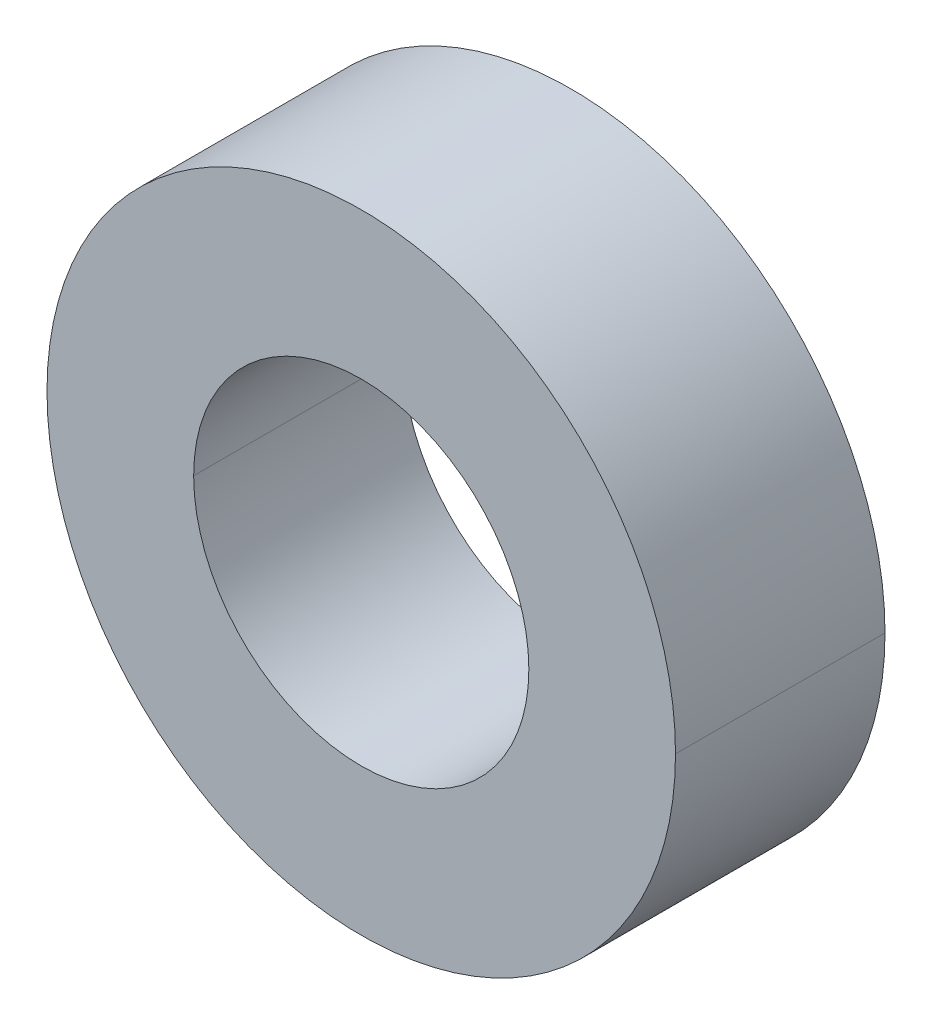
ISO-10303-21;
HEADER;
FILE_DESCRIPTION(('STEP AP214'),'2;1');
FILE_NAME('part.step','',(''),(''),'','','');
FILE_SCHEMA(('AUTOMOTIVE_DESIGN { 1 0 10303 214 1 1 1 1 }'));
ENDSEC;
DATA;
#1=APPLICATION_CONTEXT('core data for automotive mechanical design processes');
#2=APPLICATION_PROTOCOL_DEFINITION('international standard','automotive_design',2000,#1);
#3=PRODUCT_CONTEXT('',#1,'mechanical');
#4=PRODUCT('Part','Part','',(#3));
#5=PRODUCT_RELATED_PRODUCT_CATEGORY('part','',(#4));
#6=PRODUCT_DEFINITION_FORMATION('','',#4);
#7=PRODUCT_DEFINITION_CONTEXT('part definition',#1,'design');
#8=PRODUCT_DEFINITION('design','',#6,#7);
#9=PRODUCT_DEFINITION_SHAPE('','',#8);
#10=(LENGTH_UNIT() NAMED_UNIT(*) SI_UNIT(.MILLI.,.METRE.));
#11=(NAMED_UNIT(*) PLANE_ANGLE_UNIT() SI_UNIT($,.RADIAN.));
#12=(NAMED_UNIT(*) SI_UNIT($,.STERADIAN.) SOLID_ANGLE_UNIT());
#13=UNCERTAINTY_MEASURE_WITH_UNIT(LENGTH_MEASURE(1.E-05),#10,'distance_accuracy_value','');
#14=(GEOMETRIC_REPRESENTATION_CONTEXT(3) GLOBAL_UNCERTAINTY_ASSIGNED_CONTEXT((#13)) GLOBAL_UNIT_ASSIGNED_CONTEXT((#10,
#11,#12)) REPRESENTATION_CONTEXT('',''));
#15=CARTESIAN_POINT('',(0.,0.,0.));
#16=DIRECTION('',(0.,0.,1.));
#17=DIRECTION('',(1.,0.,0.));
#18=AXIS2_PLACEMENT_3D('',#15,#16,#17);
#19=CARTESIAN_POINT('',(0.,0.,2.));
#20=DIRECTION('',(0.,0.,-1.));
#21=DIRECTION('',(0.,1.,0.));
#22=AXIS2_PLACEMENT_3D('',#19,#20,#21);
#23=CYLINDRICAL_SURFACE('',#22,1.6);
#24=CARTESIAN_POINT('',(0.,0.,2.));
#25=DIRECTION('',(0.,0.,1.));
#26=DIRECTION('',(1.,0.,0.));
#27=AXIS2_PLACEMENT_3D('',#24,#25,#26);
#28=CIRCLE('',#27,1.6);
#29=CARTESIAN_POINT('',(-1.6,0.,2.));
#30=VERTEX_POINT('',#29);
#31=CARTESIAN_POINT('',(1.6,0.,2.));
#32=VERTEX_POINT('',#31);
#33=EDGE_CURVE('E11',#30,#32,#28,.T.);
#34=ORIENTED_EDGE('',*,*,#33,.T.);
#35=DIRECTION('',(0.,0.,-1.));
#36=VECTOR('',#35,1.);
#37=CARTESIAN_POINT('',(1.6,0.,2.));
#38=LINE('',#37,#36);
#39=CARTESIAN_POINT('',(1.6,0.,0.));
#40=VERTEX_POINT('',#39);
#41=EDGE_CURVE('E25',#32,#40,#38,.T.);
#42=ORIENTED_EDGE('',*,*,#41,.T.);
#43=CARTESIAN_POINT('',(0.,0.,0.));
#44=DIRECTION('',(0.,0.,1.));
#45=DIRECTION('',(1.,0.,0.));
#46=AXIS2_PLACEMENT_3D('',#43,#44,#45);
#47=CIRCLE('',#46,1.6);
#48=CARTESIAN_POINT('',(-1.6,0.,0.));
#49=VERTEX_POINT('',#48);
#50=EDGE_CURVE('E100',#49,#40,#47,.T.);
#51=ORIENTED_EDGE('',*,*,#50,.F.);
#52=DIRECTION('',(0.,0.,-1.));
#53=VECTOR('',#52,1.);
#54=CARTESIAN_POINT('',(-1.6,0.,2.));
#55=LINE('',#54,#53);
#56=EDGE_CURVE('E95',#30,#49,#55,.T.);
#57=ORIENTED_EDGE('',*,*,#56,.F.);
#58=EDGE_LOOP('',(#34,#42,#51,#57));
#59=FACE_BOUND('',#58,.T.);
#60=ADVANCED_FACE('F17',(#59),#23,.F.);
#61=CARTESIAN_POINT('',(0.,0.,2.));
#62=DIRECTION('',(0.,0.,-1.));
#63=DIRECTION('',(0.,-1.,0.));
#64=AXIS2_PLACEMENT_3D('',#61,#62,#63);
#65=CYLINDRICAL_SURFACE('',#64,1.6);
#66=ORIENTED_EDGE('',*,*,#41,.F.);
#67=CARTESIAN_POINT('',(0.,0.,2.));
#68=DIRECTION('',(0.,0.,1.));
#69=DIRECTION('',(1.,0.,0.));
#70=AXIS2_PLACEMENT_3D('',#67,#68,#69);
#71=CIRCLE('',#70,1.6);
#72=EDGE_CURVE('E90',#32,#30,#71,.T.);
#73=ORIENTED_EDGE('',*,*,#72,.T.);
#74=ORIENTED_EDGE('',*,*,#56,.T.);
#75=CARTESIAN_POINT('',(0.,0.,0.));
#76=DIRECTION('',(0.,0.,1.));
#77=DIRECTION('',(1.,0.,0.));
#78=AXIS2_PLACEMENT_3D('',#75,#76,#77);
#79=CIRCLE('',#78,1.6);
#80=EDGE_CURVE('E85',#40,#49,#79,.T.);
#81=ORIENTED_EDGE('',*,*,#80,.F.);
#82=EDGE_LOOP('',(#66,#73,#74,#81));
#83=FACE_BOUND('',#82,.T.);
#84=ADVANCED_FACE('F112',(#83),#65,.F.);
#85=CARTESIAN_POINT('',(0.,0.,0.));
#86=DIRECTION('',(0.,0.,1.));
#87=DIRECTION('',(1.,0.,0.));
#88=AXIS2_PLACEMENT_3D('',#85,#86,#87);
#89=PLANE('',#88);
#90=CARTESIAN_POINT('',(0.,0.,0.));
#91=DIRECTION('',(0.,0.,1.));
#92=DIRECTION('',(1.,0.,0.));
#93=AXIS2_PLACEMENT_3D('',#90,#91,#92);
#94=CIRCLE('',#93,3.);
#95=CARTESIAN_POINT('',(-3.,0.,0.));
#96=VERTEX_POINT('',#95);
#97=CARTESIAN_POINT('',(3.,0.,0.));
#98=VERTEX_POINT('',#97);
#99=EDGE_CURVE('E74',#96,#98,#94,.T.);
#100=ORIENTED_EDGE('',*,*,#99,.F.);
#101=CARTESIAN_POINT('',(0.,0.,0.));
#102=DIRECTION('',(0.,0.,1.));
#103=DIRECTION('',(1.,0.,0.));
#104=AXIS2_PLACEMENT_3D('',#101,#102,#103);
#105=CIRCLE('',#104,3.);
#106=EDGE_CURVE('E61',#98,#96,#105,.T.);
#107=ORIENTED_EDGE('',*,*,#106,.F.);
#108=EDGE_LOOP('',(#100,#107));
#109=FACE_BOUND('',#108,.T.);
#110=ORIENTED_EDGE('',*,*,#50,.T.);
#111=ORIENTED_EDGE('',*,*,#80,.T.);
#112=EDGE_LOOP('',(#110,#111));
#113=FACE_BOUND('',#112,.T.);
#114=ADVANCED_FACE('F110',(#109,#113),#89,.F.);
#115=CARTESIAN_POINT('',(0.,0.,2.));
#116=DIRECTION('',(0.,0.,-1.));
#117=DIRECTION('',(0.,-1.,0.));
#118=AXIS2_PLACEMENT_3D('',#115,#116,#117);
#119=CYLINDRICAL_SURFACE('',#118,3.);
#120=CARTESIAN_POINT('',(0.,0.,2.));
#121=DIRECTION('',(0.,0.,1.));
#122=DIRECTION('',(1.,0.,0.));
#123=AXIS2_PLACEMENT_3D('',#120,#121,#122);
#124=CIRCLE('',#123,3.);
#125=CARTESIAN_POINT('',(3.,0.,2.));
#126=VERTEX_POINT('',#125);
#127=CARTESIAN_POINT('',(-3.,0.,2.));
#128=VERTEX_POINT('',#127);
#129=EDGE_CURVE('E59',#126,#128,#124,.T.);
#130=ORIENTED_EDGE('',*,*,#129,.F.);
#131=DIRECTION('',(0.,0.,-1.));
#132=VECTOR('',#131,1.);
#133=CARTESIAN_POINT('',(3.,0.,2.));
#134=LINE('',#133,#132);
#135=EDGE_CURVE('E64',#126,#98,#134,.T.);
#136=ORIENTED_EDGE('',*,*,#135,.T.);
#137=ORIENTED_EDGE('',*,*,#106,.T.);
#138=DIRECTION('',(0.,0.,-1.));
#139=VECTOR('',#138,1.);
#140=CARTESIAN_POINT('',(-3.,0.,2.));
#141=LINE('',#140,#139);
#142=EDGE_CURVE('E54',#128,#96,#141,.T.);
#143=ORIENTED_EDGE('',*,*,#142,.F.);
#144=EDGE_LOOP('',(#130,#136,#137,#143));
#145=FACE_BOUND('',#144,.T.);
#146=ADVANCED_FACE('F56',(#145),#119,.T.);
#147=CARTESIAN_POINT('',(0.,0.,2.));
#148=DIRECTION('',(0.,0.,-1.));
#149=DIRECTION('',(0.,1.,0.));
#150=AXIS2_PLACEMENT_3D('',#147,#148,#149);
#151=CYLINDRICAL_SURFACE('',#150,3.);
#152=ORIENTED_EDGE('',*,*,#135,.F.);
#153=CARTESIAN_POINT('',(0.,0.,2.));
#154=DIRECTION('',(0.,0.,1.));
#155=DIRECTION('',(1.,0.,0.));
#156=AXIS2_PLACEMENT_3D('',#153,#154,#155);
#157=CIRCLE('',#156,3.);
#158=EDGE_CURVE('E65',#128,#126,#157,.T.);
#159=ORIENTED_EDGE('',*,*,#158,.F.);
#160=ORIENTED_EDGE('',*,*,#142,.T.);
#161=ORIENTED_EDGE('',*,*,#99,.T.);
#162=EDGE_LOOP('',(#152,#159,#160,#161));
#163=FACE_BOUND('',#162,.T.);
#164=ADVANCED_FACE('F68',(#163),#151,.T.);
#165=CARTESIAN_POINT('',(0.,0.,2.));
#166=DIRECTION('',(0.,0.,1.));
#167=DIRECTION('',(1.,0.,0.));
#168=AXIS2_PLACEMENT_3D('',#165,#166,#167);
#169=PLANE('',#168);
#170=ORIENTED_EDGE('',*,*,#158,.T.);
#171=ORIENTED_EDGE('',*,*,#129,.T.);
#172=EDGE_LOOP('',(#170,#171));
#173=FACE_BOUND('',#172,.T.);
#174=ORIENTED_EDGE('',*,*,#33,.F.);
#175=ORIENTED_EDGE('',*,*,#72,.F.);
#176=EDGE_LOOP('',(#174,#175));
#177=FACE_BOUND('',#176,.T.);
#178=ADVANCED_FACE('F71',(#173,#177),#169,.T.);
#179=CLOSED_SHELL('',(#60,#84,#114,#146,#164,#178));
#180=MANIFOLD_SOLID_BREP('B1',#179);
#181=ADVANCED_BREP_SHAPE_REPRESENTATION('',(#18,#180),#14);
#182=SHAPE_DEFINITION_REPRESENTATION(#9,#181);
ENDSEC;
END-ISO-10303-21;
